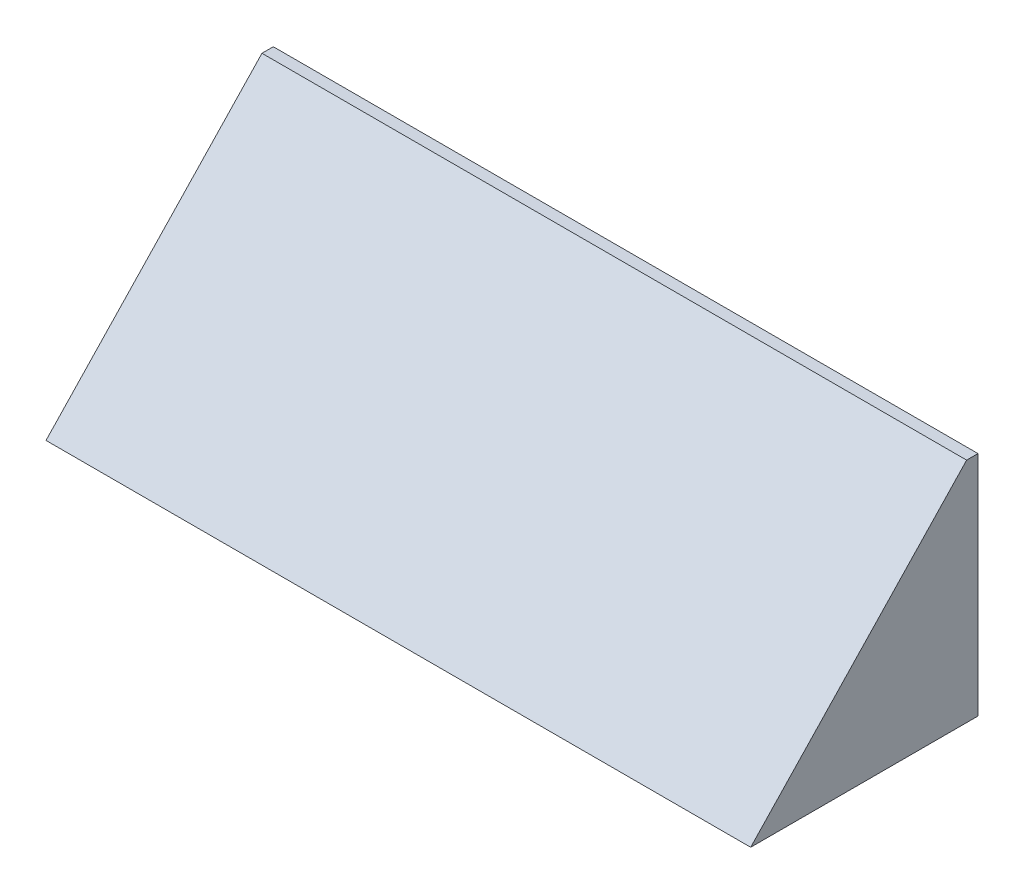
ISO-10303-21;
HEADER;
FILE_DESCRIPTION(('STEP AP214'),'2;1');
FILE_NAME('part.step','',(''),(''),'','','');
FILE_SCHEMA(('AUTOMOTIVE_DESIGN { 1 0 10303 214 1 1 1 1 }'));
ENDSEC;
DATA;
#1=APPLICATION_CONTEXT('core data for automotive mechanical design processes');
#2=APPLICATION_PROTOCOL_DEFINITION('international standard','automotive_design',2000,#1);
#3=PRODUCT_CONTEXT('',#1,'mechanical');
#4=PRODUCT('Part','Part','',(#3));
#5=PRODUCT_RELATED_PRODUCT_CATEGORY('part','',(#4));
#6=PRODUCT_DEFINITION_FORMATION('','',#4);
#7=PRODUCT_DEFINITION_CONTEXT('part definition',#1,'design');
#8=PRODUCT_DEFINITION('design','',#6,#7);
#9=PRODUCT_DEFINITION_SHAPE('','',#8);
#10=(LENGTH_UNIT() NAMED_UNIT(*) SI_UNIT(.MILLI.,.METRE.));
#11=(NAMED_UNIT(*) PLANE_ANGLE_UNIT() SI_UNIT($,.RADIAN.));
#12=(NAMED_UNIT(*) SI_UNIT($,.STERADIAN.) SOLID_ANGLE_UNIT());
#13=UNCERTAINTY_MEASURE_WITH_UNIT(LENGTH_MEASURE(1.E-05),#10,'distance_accuracy_value','');
#14=(GEOMETRIC_REPRESENTATION_CONTEXT(3) GLOBAL_UNCERTAINTY_ASSIGNED_CONTEXT((#13)) GLOBAL_UNIT_ASSIGNED_CONTEXT((#10,
#11,#12)) REPRESENTATION_CONTEXT('',''));
#15=CARTESIAN_POINT('',(0.,0.,0.));
#16=DIRECTION('',(0.,0.,1.));
#17=DIRECTION('',(1.,0.,0.));
#18=AXIS2_PLACEMENT_3D('',#15,#16,#17);
#19=CARTESIAN_POINT('',(0.,0.,0.));
#20=DIRECTION('',(0.,-1.,0.));
#21=DIRECTION('',(0.,0.,-1.));
#22=AXIS2_PLACEMENT_3D('',#19,#20,#21);
#23=PLANE('',#22);
#24=DIRECTION('',(0.,0.,1.));
#25=VECTOR('',#24,1.);
#26=CARTESIAN_POINT('',(-31.1995296884186,0.,-4.85114638447959));
#27=LINE('',#26,#25);
#28=CARTESIAN_POINT('',(-31.1995296884186,0.,-24.8511463844796));
#29=VERTEX_POINT('',#28);
#30=CARTESIAN_POINT('',(-31.1995296884186,0.,-4.85114638447959));
#31=VERTEX_POINT('',#30);
#32=EDGE_CURVE('E135',#29,#31,#27,.T.);
#33=ORIENTED_EDGE('',*,*,#32,.F.);
#34=DIRECTION('',(-1.,0.,0.));
#35=VECTOR('',#34,1.);
#36=CARTESIAN_POINT('',(-31.1995296884186,0.,-24.8511463844796));
#37=LINE('',#36,#35);
#38=CARTESIAN_POINT('',(30.8004703115814,0.,-24.8511463844796));
#39=VERTEX_POINT('',#38);
#40=EDGE_CURVE('E224',#39,#29,#37,.T.);
#41=ORIENTED_EDGE('',*,*,#40,.F.);
#42=DIRECTION('',(0.,0.,-1.));
#43=VECTOR('',#42,1.);
#44=CARTESIAN_POINT('',(30.8004703115814,0.,-24.8511463844796));
#45=LINE('',#44,#43);
#46=CARTESIAN_POINT('',(30.8004703115814,0.,-4.85114638447959));
#47=VERTEX_POINT('',#46);
#48=EDGE_CURVE('E193',#47,#39,#45,.T.);
#49=ORIENTED_EDGE('',*,*,#48,.F.);
#50=DIRECTION('',(1.,0.,0.));
#51=VECTOR('',#50,1.);
#52=CARTESIAN_POINT('',(30.8004703115814,0.,-4.85114638447959));
#53=LINE('',#52,#51);
#54=EDGE_CURVE('E141',#31,#47,#53,.T.);
#55=ORIENTED_EDGE('',*,*,#54,.F.);
#56=EDGE_LOOP('',(#33,#41,#49,#55));
#57=FACE_BOUND('',#56,.T.);
#58=DIRECTION('',(-1.,0.,0.));
#59=VECTOR('',#58,1.);
#60=CARTESIAN_POINT('',(0.,0.,-23.8511463844796));
#61=LINE('',#60,#59);
#62=CARTESIAN_POINT('',(29.8004703115814,0.,-23.8511463844796));
#63=VERTEX_POINT('',#62);
#64=CARTESIAN_POINT('',(-30.1995296884186,0.,-23.8511463844796));
#65=VERTEX_POINT('',#64);
#66=EDGE_CURVE('E129',#63,#65,#61,.T.);
#67=ORIENTED_EDGE('',*,*,#66,.T.);
#68=DIRECTION('',(0.,0.,1.));
#69=VECTOR('',#68,1.);
#70=CARTESIAN_POINT('',(-30.1995296884186,0.,0.));
#71=LINE('',#70,#69);
#72=CARTESIAN_POINT('',(-30.1995296884186,0.,-6.23045780689297));
#73=VERTEX_POINT('',#72);
#74=EDGE_CURVE('E123',#65,#73,#71,.T.);
#75=ORIENTED_EDGE('',*,*,#74,.T.);
#76=DIRECTION('',(1.,0.,0.));
#77=VECTOR('',#76,1.);
#78=CARTESIAN_POINT('',(0.,0.,-6.23045780689297));
#79=LINE('',#78,#77);
#80=CARTESIAN_POINT('',(29.8004703115814,0.,-6.23045780689297));
#81=VERTEX_POINT('',#80);
#82=EDGE_CURVE('E110',#73,#81,#79,.T.);
#83=ORIENTED_EDGE('',*,*,#82,.T.);
#84=DIRECTION('',(0.,0.,-1.));
#85=VECTOR('',#84,1.);
#86=CARTESIAN_POINT('',(29.8004703115814,0.,0.));
#87=LINE('',#86,#85);
#88=EDGE_CURVE('E66',#81,#63,#87,.T.);
#89=ORIENTED_EDGE('',*,*,#88,.T.);
#90=EDGE_LOOP('',(#67,#75,#83,#89));
#91=FACE_BOUND('',#90,.T.);
#92=ADVANCED_FACE('F47',(#57,#91),#23,.T.);
#93=CARTESIAN_POINT('',(0.,20.,0.));
#94=DIRECTION('',(0.,1.,0.));
#95=DIRECTION('',(0.,0.,1.));
#96=AXIS2_PLACEMENT_3D('',#93,#94,#95);
#97=PLANE('',#96);
#98=DIRECTION('',(0.,0.,1.));
#99=VECTOR('',#98,1.);
#100=CARTESIAN_POINT('',(-31.1995296884186,20.,-24.8511463844796));
#101=LINE('',#100,#99);
#102=CARTESIAN_POINT('',(-31.1995296884186,20.,-24.8511463844796));
#103=VERTEX_POINT('',#102);
#104=CARTESIAN_POINT('',(-31.1995296884186,20.,-23.8511463844796));
#105=VERTEX_POINT('',#104);
#106=EDGE_CURVE('E258',#103,#105,#101,.T.);
#107=ORIENTED_EDGE('',*,*,#106,.T.);
#108=DIRECTION('',(1.,0.,0.));
#109=VECTOR('',#108,1.);
#110=CARTESIAN_POINT('',(-31.1995296884186,20.,-23.8511463844796));
#111=LINE('',#110,#109);
#112=CARTESIAN_POINT('',(30.8004703115814,20.,-23.8511463844796));
#113=VERTEX_POINT('',#112);
#114=EDGE_CURVE('E249',#105,#113,#111,.T.);
#115=ORIENTED_EDGE('',*,*,#114,.T.);
#116=DIRECTION('',(0.,0.,-1.));
#117=VECTOR('',#116,1.);
#118=CARTESIAN_POINT('',(30.8004703115814,20.,-23.8511463844796));
#119=LINE('',#118,#117);
#120=CARTESIAN_POINT('',(30.8004703115814,20.,-24.8511463844796));
#121=VERTEX_POINT('',#120);
#122=EDGE_CURVE('E58',#113,#121,#119,.T.);
#123=ORIENTED_EDGE('',*,*,#122,.T.);
#124=DIRECTION('',(-1.,0.,0.));
#125=VECTOR('',#124,1.);
#126=CARTESIAN_POINT('',(-31.1995296884186,20.,-24.8511463844796));
#127=LINE('',#126,#125);
#128=EDGE_CURVE('E12',#121,#103,#127,.T.);
#129=ORIENTED_EDGE('',*,*,#128,.T.);
#130=EDGE_LOOP('',(#107,#115,#123,#129));
#131=FACE_BOUND('',#130,.T.);
#132=ADVANCED_FACE('F49',(#131),#97,.T.);
#133=CARTESIAN_POINT('',(30.8004703115814,0.,0.));
#134=DIRECTION('',(-1.,0.,0.));
#135=DIRECTION('',(0.,0.,1.));
#136=AXIS2_PLACEMENT_3D('',#133,#134,#135);
#137=PLANE('',#136);
#138=DIRECTION('',(0.,1.,0.));
#139=VECTOR('',#138,1.);
#140=CARTESIAN_POINT('',(30.8004703115814,0.,-24.8511463844796));
#141=LINE('',#140,#139);
#142=EDGE_CURVE('E74',#39,#121,#141,.T.);
#143=ORIENTED_EDGE('',*,*,#142,.T.);
#144=ORIENTED_EDGE('',*,*,#122,.F.);
#145=DIRECTION('',(0.,0.724999433594414,-0.688749461914693));
#146=VECTOR('',#145,1.);
#147=CARTESIAN_POINT('',(30.8004703115814,0.,-4.85114638447959));
#148=LINE('',#147,#146);
#149=EDGE_CURVE('E281',#47,#113,#148,.T.);
#150=ORIENTED_EDGE('',*,*,#149,.F.);
#151=ORIENTED_EDGE('',*,*,#48,.T.);
#152=EDGE_LOOP('',(#143,#144,#150,#151));
#153=FACE_BOUND('',#152,.T.);
#154=ADVANCED_FACE('F160',(#153),#137,.F.);
#155=CARTESIAN_POINT('',(0.,-2.42238584244711,-2.54987983415485));
#156=DIRECTION('',(0.,-0.688749461914693,-0.724999433594414));
#157=DIRECTION('',(0.,0.724999433594414,-0.688749461914693));
#158=AXIS2_PLACEMENT_3D('',#155,#156,#157);
#159=PLANE('',#158);
#160=ORIENTED_EDGE('',*,*,#149,.T.);
#161=ORIENTED_EDGE('',*,*,#114,.F.);
#162=DIRECTION('',(0.,0.724999433594414,-0.688749461914693));
#163=VECTOR('',#162,1.);
#164=CARTESIAN_POINT('',(-31.1995296884186,0.,-4.85114638447959));
#165=LINE('',#164,#163);
#166=EDGE_CURVE('E147',#31,#105,#165,.T.);
#167=ORIENTED_EDGE('',*,*,#166,.F.);
#168=ORIENTED_EDGE('',*,*,#54,.T.);
#169=EDGE_LOOP('',(#160,#161,#167,#168));
#170=FACE_BOUND('',#169,.T.);
#171=ADVANCED_FACE('F149',(#170),#159,.F.);
#172=CARTESIAN_POINT('',(0.,0.,-24.8511463844796));
#173=DIRECTION('',(0.,0.,1.));
#174=DIRECTION('',(1.,0.,0.));
#175=AXIS2_PLACEMENT_3D('',#172,#173,#174);
#176=PLANE('',#175);
#177=DIRECTION('',(0.,1.,0.));
#178=VECTOR('',#177,1.);
#179=CARTESIAN_POINT('',(-31.1995296884186,0.,-24.8511463844796));
#180=LINE('',#179,#178);
#181=EDGE_CURVE('E270',#29,#103,#180,.T.);
#182=ORIENTED_EDGE('',*,*,#181,.T.);
#183=ORIENTED_EDGE('',*,*,#128,.F.);
#184=ORIENTED_EDGE('',*,*,#142,.F.);
#185=ORIENTED_EDGE('',*,*,#40,.T.);
#186=EDGE_LOOP('',(#182,#183,#184,#185));
#187=FACE_BOUND('',#186,.T.);
#188=ADVANCED_FACE('F159',(#187),#176,.F.);
#189=CARTESIAN_POINT('',(-31.1995296884186,0.,0.));
#190=DIRECTION('',(1.,0.,0.));
#191=DIRECTION('',(0.,0.,-1.));
#192=AXIS2_PLACEMENT_3D('',#189,#190,#191);
#193=PLANE('',#192);
#194=ORIENTED_EDGE('',*,*,#166,.T.);
#195=ORIENTED_EDGE('',*,*,#106,.F.);
#196=ORIENTED_EDGE('',*,*,#181,.F.);
#197=ORIENTED_EDGE('',*,*,#32,.T.);
#198=EDGE_LOOP('',(#194,#195,#196,#197));
#199=FACE_BOUND('',#198,.T.);
#200=ADVANCED_FACE('F297',(#199),#193,.F.);
#201=CARTESIAN_POINT('',(29.8004703115814,0.,0.));
#202=DIRECTION('',(-1.,0.,0.));
#203=DIRECTION('',(0.,0.,1.));
#204=AXIS2_PLACEMENT_3D('',#201,#202,#203);
#205=PLANE('',#204);
#206=DIRECTION('',(0.,1.,0.));
#207=VECTOR('',#206,1.);
#208=CARTESIAN_POINT('',(29.8004703115814,0.,-23.8511463844796));
#209=LINE('',#208,#207);
#210=CARTESIAN_POINT('',(29.8004703115814,18.5480932395649,-23.8511463844796));
#211=VERTEX_POINT('',#210);
#212=EDGE_CURVE('E117',#63,#211,#209,.T.);
#213=ORIENTED_EDGE('',*,*,#212,.F.);
#214=ORIENTED_EDGE('',*,*,#88,.F.);
#215=DIRECTION('',(0.,0.724999433594414,-0.688749461914693));
#216=VECTOR('',#215,1.);
#217=CARTESIAN_POINT('',(29.8004703115814,-3.1111353043618,-3.27487926774926));
#218=LINE('',#217,#216);
#219=EDGE_CURVE('E114',#81,#211,#218,.T.);
#220=ORIENTED_EDGE('',*,*,#219,.T.);
#221=EDGE_LOOP('',(#213,#214,#220));
#222=FACE_BOUND('',#221,.T.);
#223=ADVANCED_FACE('F305',(#222),#205,.T.);
#224=CARTESIAN_POINT('',(0.,-3.1111353043618,-3.27487926774926));
#225=DIRECTION('',(0.,-0.688749461914693,-0.724999433594414));
#226=DIRECTION('',(0.,0.724999433594414,-0.688749461914693));
#227=AXIS2_PLACEMENT_3D('',#224,#225,#226);
#228=PLANE('',#227);
#229=DIRECTION('',(1.,0.,0.));
#230=VECTOR('',#229,1.);
#231=CARTESIAN_POINT('',(0.,18.5480932395649,-23.8511463844796));
#232=LINE('',#231,#230);
#233=CARTESIAN_POINT('',(-30.1995296884186,18.5480932395649,-23.8511463844796));
#234=VERTEX_POINT('',#233);
#235=EDGE_CURVE('E126',#234,#211,#232,.T.);
#236=ORIENTED_EDGE('',*,*,#235,.T.);
#237=ORIENTED_EDGE('',*,*,#219,.F.);
#238=ORIENTED_EDGE('',*,*,#82,.F.);
#239=DIRECTION('',(0.,0.724999433594414,-0.688749461914693));
#240=VECTOR('',#239,1.);
#241=CARTESIAN_POINT('',(-30.1995296884186,-3.1111353043618,-3.27487926774926));
#242=LINE('',#241,#240);
#243=EDGE_CURVE('E113',#73,#234,#242,.T.);
#244=ORIENTED_EDGE('',*,*,#243,.T.);
#245=EDGE_LOOP('',(#236,#237,#238,#244));
#246=FACE_BOUND('',#245,.T.);
#247=ADVANCED_FACE('F112',(#246),#228,.T.);
#248=CARTESIAN_POINT('',(0.,0.,-23.8511463844796));
#249=DIRECTION('',(0.,0.,1.));
#250=DIRECTION('',(1.,0.,0.));
#251=AXIS2_PLACEMENT_3D('',#248,#249,#250);
#252=PLANE('',#251);
#253=DIRECTION('',(0.,1.,0.));
#254=VECTOR('',#253,1.);
#255=CARTESIAN_POINT('',(-30.1995296884186,0.,-23.8511463844796));
#256=LINE('',#255,#254);
#257=EDGE_CURVE('E125',#65,#234,#256,.T.);
#258=ORIENTED_EDGE('',*,*,#257,.F.);
#259=ORIENTED_EDGE('',*,*,#66,.F.);
#260=ORIENTED_EDGE('',*,*,#212,.T.);
#261=ORIENTED_EDGE('',*,*,#235,.F.);
#262=EDGE_LOOP('',(#258,#259,#260,#261));
#263=FACE_BOUND('',#262,.T.);
#264=ADVANCED_FACE('F363',(#263),#252,.T.);
#265=CARTESIAN_POINT('',(-30.1995296884186,0.,0.));
#266=DIRECTION('',(1.,0.,0.));
#267=DIRECTION('',(0.,0.,-1.));
#268=AXIS2_PLACEMENT_3D('',#265,#266,#267);
#269=PLANE('',#268);
#270=ORIENTED_EDGE('',*,*,#243,.F.);
#271=ORIENTED_EDGE('',*,*,#74,.F.);
#272=ORIENTED_EDGE('',*,*,#257,.T.);
#273=EDGE_LOOP('',(#270,#271,#272));
#274=FACE_BOUND('',#273,.T.);
#275=ADVANCED_FACE('F122',(#274),#269,.T.);
#276=CLOSED_SHELL('',(#92,#132,#154,#171,#188,#200,#223,#247,#264,#275));
#277=MANIFOLD_SOLID_BREP('B2',#276);
#278=ADVANCED_BREP_SHAPE_REPRESENTATION('',(#18,#277),#14);
#279=SHAPE_DEFINITION_REPRESENTATION(#9,#278);
ENDSEC;
END-ISO-10303-21;
